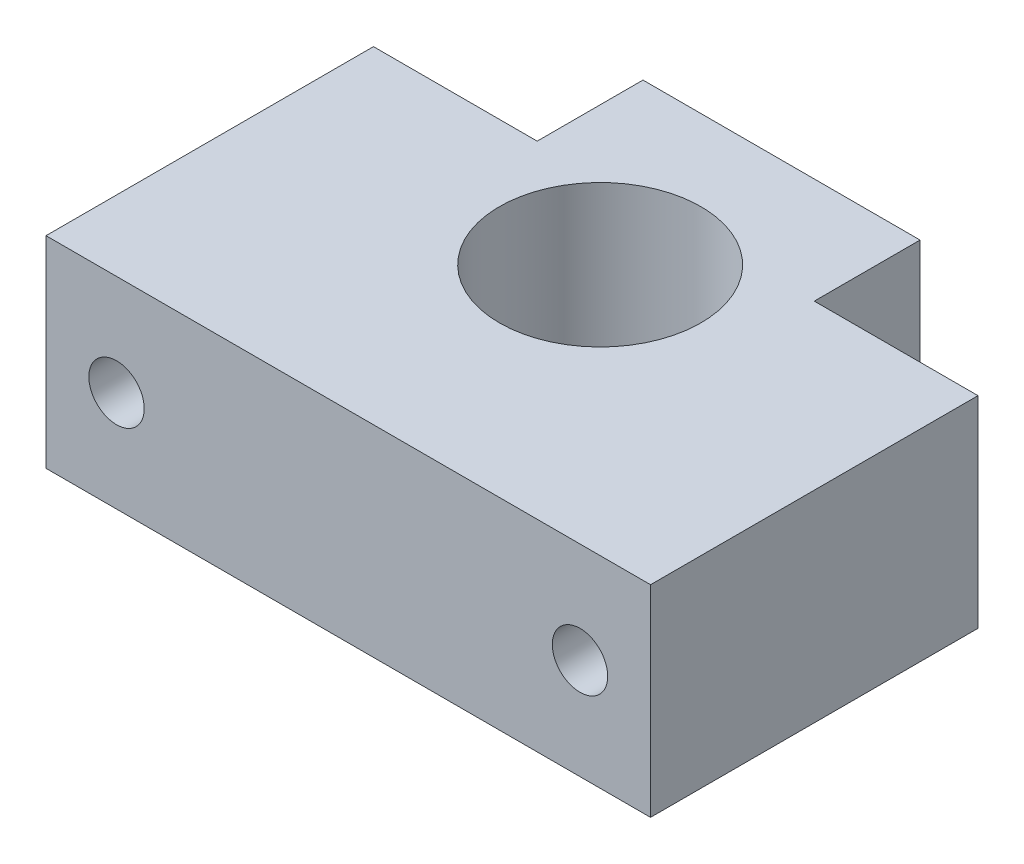
ISO-10303-21;
HEADER;
FILE_DESCRIPTION(('STEP AP214'),'2;1');
FILE_NAME('part.step','',(''),(''),'','','');
FILE_SCHEMA(('AUTOMOTIVE_DESIGN { 1 0 10303 214 1 1 1 1 }'));
ENDSEC;
DATA;
#1=APPLICATION_CONTEXT('core data for automotive mechanical design processes');
#2=APPLICATION_PROTOCOL_DEFINITION('international standard','automotive_design',2000,#1);
#3=PRODUCT_CONTEXT('',#1,'mechanical');
#4=PRODUCT('Part','Part','',(#3));
#5=PRODUCT_RELATED_PRODUCT_CATEGORY('part','',(#4));
#6=PRODUCT_DEFINITION_FORMATION('','',#4);
#7=PRODUCT_DEFINITION_CONTEXT('part definition',#1,'design');
#8=PRODUCT_DEFINITION('design','',#6,#7);
#9=PRODUCT_DEFINITION_SHAPE('','',#8);
#10=(LENGTH_UNIT() NAMED_UNIT(*) SI_UNIT(.MILLI.,.METRE.));
#11=(NAMED_UNIT(*) PLANE_ANGLE_UNIT() SI_UNIT($,.RADIAN.));
#12=(NAMED_UNIT(*) SI_UNIT($,.STERADIAN.) SOLID_ANGLE_UNIT());
#13=UNCERTAINTY_MEASURE_WITH_UNIT(LENGTH_MEASURE(1.E-05),#10,'distance_accuracy_value','');
#14=(GEOMETRIC_REPRESENTATION_CONTEXT(3) GLOBAL_UNCERTAINTY_ASSIGNED_CONTEXT((#13)) GLOBAL_UNIT_ASSIGNED_CONTEXT((#10,
#11,#12)) REPRESENTATION_CONTEXT('',''));
#15=CARTESIAN_POINT('',(0.,0.,0.));
#16=DIRECTION('',(0.,0.,1.));
#17=DIRECTION('',(1.,0.,0.));
#18=AXIS2_PLACEMENT_3D('',#15,#16,#17);
#19=CARTESIAN_POINT('',(60.,20.,0.));
#20=DIRECTION('',(0.,0.,-1.));
#21=DIRECTION('',(-1.,0.,0.));
#22=AXIS2_PLACEMENT_3D('',#19,#20,#21);
#23=PLANE('',#22);
#24=CARTESIAN_POINT('',(7.,10.,0.));
#25=DIRECTION('',(0.,0.,1.));
#26=DIRECTION('',(1.,0.,0.));
#27=AXIS2_PLACEMENT_3D('',#24,#25,#26);
#28=CIRCLE('',#27,2.75);
#29=CARTESIAN_POINT('',(9.75,10.,0.));
#30=VERTEX_POINT('',#29);
#31=EDGE_CURVE('E228',#30,#30,#28,.T.);
#32=ORIENTED_EDGE('',*,*,#31,.F.);
#33=EDGE_LOOP('',(#32));
#34=FACE_BOUND('',#33,.T.);
#35=CARTESIAN_POINT('',(53.,10.,0.));
#36=DIRECTION('',(0.,0.,1.));
#37=DIRECTION('',(1.,0.,0.));
#38=AXIS2_PLACEMENT_3D('',#35,#36,#37);
#39=CIRCLE('',#38,2.75);
#40=CARTESIAN_POINT('',(55.75,10.,0.));
#41=VERTEX_POINT('',#40);
#42=EDGE_CURVE('E224',#41,#41,#39,.T.);
#43=ORIENTED_EDGE('',*,*,#42,.F.);
#44=EDGE_LOOP('',(#43));
#45=FACE_BOUND('',#44,.T.);
#46=DIRECTION('',(1.,0.,0.));
#47=VECTOR('',#46,1.);
#48=CARTESIAN_POINT('',(60.,0.,0.));
#49=LINE('',#48,#47);
#50=CARTESIAN_POINT('',(0.,0.,0.));
#51=VERTEX_POINT('',#50);
#52=CARTESIAN_POINT('',(60.,0.,0.));
#53=VERTEX_POINT('',#52);
#54=EDGE_CURVE('E145',#51,#53,#49,.T.);
#55=ORIENTED_EDGE('',*,*,#54,.T.);
#56=DIRECTION('',(0.,-1.,0.));
#57=VECTOR('',#56,1.);
#58=CARTESIAN_POINT('',(60.,20.,0.));
#59=LINE('',#58,#57);
#60=CARTESIAN_POINT('',(60.,20.,0.));
#61=VERTEX_POINT('',#60);
#62=EDGE_CURVE('E11',#61,#53,#59,.T.);
#63=ORIENTED_EDGE('',*,*,#62,.F.);
#64=DIRECTION('',(1.,0.,0.));
#65=VECTOR('',#64,1.);
#66=CARTESIAN_POINT('',(60.,20.,0.));
#67=LINE('',#66,#65);
#68=CARTESIAN_POINT('',(0.,20.,0.));
#69=VERTEX_POINT('',#68);
#70=EDGE_CURVE('E168',#69,#61,#67,.T.);
#71=ORIENTED_EDGE('',*,*,#70,.F.);
#72=DIRECTION('',(0.,-1.,0.));
#73=VECTOR('',#72,1.);
#74=CARTESIAN_POINT('',(0.,20.,0.));
#75=LINE('',#74,#73);
#76=EDGE_CURVE('E141',#69,#51,#75,.T.);
#77=ORIENTED_EDGE('',*,*,#76,.T.);
#78=EDGE_LOOP('',(#55,#63,#71,#77));
#79=FACE_BOUND('',#78,.T.);
#80=ADVANCED_FACE('F44',(#34,#45,#79),#23,.F.);
#81=CARTESIAN_POINT('',(60.,20.,0.));
#82=DIRECTION('',(-1.,0.,0.));
#83=DIRECTION('',(0.,0.,1.));
#84=AXIS2_PLACEMENT_3D('',#81,#82,#83);
#85=PLANE('',#84);
#86=DIRECTION('',(0.,0.,-1.));
#87=VECTOR('',#86,1.);
#88=CARTESIAN_POINT('',(60.,0.,0.));
#89=LINE('',#88,#87);
#90=CARTESIAN_POINT('',(60.,0.,-32.5));
#91=VERTEX_POINT('',#90);
#92=EDGE_CURVE('E149',#53,#91,#89,.T.);
#93=ORIENTED_EDGE('',*,*,#92,.T.);
#94=DIRECTION('',(0.,-1.,0.));
#95=VECTOR('',#94,1.);
#96=CARTESIAN_POINT('',(60.,20.,-32.5));
#97=LINE('',#96,#95);
#98=CARTESIAN_POINT('',(60.,20.,-32.5));
#99=VERTEX_POINT('',#98);
#100=EDGE_CURVE('E53',#99,#91,#97,.T.);
#101=ORIENTED_EDGE('',*,*,#100,.F.);
#102=DIRECTION('',(0.,0.,-1.));
#103=VECTOR('',#102,1.);
#104=CARTESIAN_POINT('',(60.,20.,0.));
#105=LINE('',#104,#103);
#106=EDGE_CURVE('E104',#61,#99,#105,.T.);
#107=ORIENTED_EDGE('',*,*,#106,.F.);
#108=ORIENTED_EDGE('',*,*,#62,.T.);
#109=EDGE_LOOP('',(#93,#101,#107,#108));
#110=FACE_BOUND('',#109,.T.);
#111=ADVANCED_FACE('F247',(#110),#85,.F.);
#112=CARTESIAN_POINT('',(60.,20.,-32.5));
#113=DIRECTION('',(0.,0.,1.));
#114=DIRECTION('',(1.,0.,0.));
#115=AXIS2_PLACEMENT_3D('',#112,#113,#114);
#116=PLANE('',#115);
#117=DIRECTION('',(-1.,0.,0.));
#118=VECTOR('',#117,1.);
#119=CARTESIAN_POINT('',(60.,0.,-32.5));
#120=LINE('',#119,#118);
#121=CARTESIAN_POINT('',(43.75,0.,-32.5));
#122=VERTEX_POINT('',#121);
#123=EDGE_CURVE('E153',#91,#122,#120,.T.);
#124=ORIENTED_EDGE('',*,*,#123,.T.);
#125=DIRECTION('',(0.,-1.,0.));
#126=VECTOR('',#125,1.);
#127=CARTESIAN_POINT('',(43.75,20.,-32.5));
#128=LINE('',#127,#126);
#129=CARTESIAN_POINT('',(43.75,20.,-32.5));
#130=VERTEX_POINT('',#129);
#131=EDGE_CURVE('E179',#130,#122,#128,.T.);
#132=ORIENTED_EDGE('',*,*,#131,.F.);
#133=DIRECTION('',(-1.,0.,0.));
#134=VECTOR('',#133,1.);
#135=CARTESIAN_POINT('',(60.,20.,-32.5));
#136=LINE('',#135,#134);
#137=EDGE_CURVE('E189',#99,#130,#136,.T.);
#138=ORIENTED_EDGE('',*,*,#137,.F.);
#139=ORIENTED_EDGE('',*,*,#100,.T.);
#140=EDGE_LOOP('',(#124,#132,#138,#139));
#141=FACE_BOUND('',#140,.T.);
#142=ADVANCED_FACE('F187',(#141),#116,.F.);
#143=CARTESIAN_POINT('',(43.75,20.,-43.));
#144=DIRECTION('',(-1.,0.,0.));
#145=DIRECTION('',(0.,0.,1.));
#146=AXIS2_PLACEMENT_3D('',#143,#144,#145);
#147=PLANE('',#146);
#148=DIRECTION('',(0.,0.,-1.));
#149=VECTOR('',#148,1.);
#150=CARTESIAN_POINT('',(43.75,0.,-43.));
#151=LINE('',#150,#149);
#152=CARTESIAN_POINT('',(43.75,0.,-43.));
#153=VERTEX_POINT('',#152);
#154=EDGE_CURVE('E156',#122,#153,#151,.T.);
#155=ORIENTED_EDGE('',*,*,#154,.T.);
#156=DIRECTION('',(0.,-1.,0.));
#157=VECTOR('',#156,1.);
#158=CARTESIAN_POINT('',(43.75,20.,-43.));
#159=LINE('',#158,#157);
#160=CARTESIAN_POINT('',(43.75,20.,-43.));
#161=VERTEX_POINT('',#160);
#162=EDGE_CURVE('E175',#161,#153,#159,.T.);
#163=ORIENTED_EDGE('',*,*,#162,.F.);
#164=DIRECTION('',(0.,0.,-1.));
#165=VECTOR('',#164,1.);
#166=CARTESIAN_POINT('',(43.75,20.,-43.));
#167=LINE('',#166,#165);
#168=EDGE_CURVE('E202',#130,#161,#167,.T.);
#169=ORIENTED_EDGE('',*,*,#168,.F.);
#170=ORIENTED_EDGE('',*,*,#131,.T.);
#171=EDGE_LOOP('',(#155,#163,#169,#170));
#172=FACE_BOUND('',#171,.T.);
#173=ADVANCED_FACE('F197',(#172),#147,.F.);
#174=CARTESIAN_POINT('',(16.25,20.,-43.));
#175=DIRECTION('',(0.,0.,1.));
#176=DIRECTION('',(1.,0.,0.));
#177=AXIS2_PLACEMENT_3D('',#174,#175,#176);
#178=PLANE('',#177);
#179=DIRECTION('',(-1.,0.,0.));
#180=VECTOR('',#179,1.);
#181=CARTESIAN_POINT('',(16.25,0.,-43.));
#182=LINE('',#181,#180);
#183=CARTESIAN_POINT('',(16.25,0.,-43.));
#184=VERTEX_POINT('',#183);
#185=EDGE_CURVE('E159',#153,#184,#182,.T.);
#186=ORIENTED_EDGE('',*,*,#185,.T.);
#187=DIRECTION('',(0.,-1.,0.));
#188=VECTOR('',#187,1.);
#189=CARTESIAN_POINT('',(16.25,20.,-43.));
#190=LINE('',#189,#188);
#191=CARTESIAN_POINT('',(16.25,20.,-43.));
#192=VERTEX_POINT('',#191);
#193=EDGE_CURVE('E134',#192,#184,#190,.T.);
#194=ORIENTED_EDGE('',*,*,#193,.F.);
#195=DIRECTION('',(-1.,0.,0.));
#196=VECTOR('',#195,1.);
#197=CARTESIAN_POINT('',(16.25,20.,-43.));
#198=LINE('',#197,#196);
#199=EDGE_CURVE('E123',#161,#192,#198,.T.);
#200=ORIENTED_EDGE('',*,*,#199,.F.);
#201=ORIENTED_EDGE('',*,*,#162,.T.);
#202=EDGE_LOOP('',(#186,#194,#200,#201));
#203=FACE_BOUND('',#202,.T.);
#204=ADVANCED_FACE('F200',(#203),#178,.F.);
#205=CARTESIAN_POINT('',(16.25,20.,-43.));
#206=DIRECTION('',(1.,0.,0.));
#207=DIRECTION('',(0.,0.,-1.));
#208=AXIS2_PLACEMENT_3D('',#205,#206,#207);
#209=PLANE('',#208);
#210=DIRECTION('',(0.,0.,1.));
#211=VECTOR('',#210,1.);
#212=CARTESIAN_POINT('',(16.25,0.,-43.));
#213=LINE('',#212,#211);
#214=CARTESIAN_POINT('',(16.25,0.,-32.5));
#215=VERTEX_POINT('',#214);
#216=EDGE_CURVE('E132',#184,#215,#213,.T.);
#217=ORIENTED_EDGE('',*,*,#216,.T.);
#218=DIRECTION('',(0.,-1.,0.));
#219=VECTOR('',#218,1.);
#220=CARTESIAN_POINT('',(16.25,20.,-32.5));
#221=LINE('',#220,#219);
#222=CARTESIAN_POINT('',(16.25,20.,-32.5));
#223=VERTEX_POINT('',#222);
#224=EDGE_CURVE('E129',#223,#215,#221,.T.);
#225=ORIENTED_EDGE('',*,*,#224,.F.);
#226=DIRECTION('',(0.,0.,1.));
#227=VECTOR('',#226,1.);
#228=CARTESIAN_POINT('',(16.25,20.,-43.));
#229=LINE('',#228,#227);
#230=EDGE_CURVE('E117',#192,#223,#229,.T.);
#231=ORIENTED_EDGE('',*,*,#230,.F.);
#232=ORIENTED_EDGE('',*,*,#193,.T.);
#233=EDGE_LOOP('',(#217,#225,#231,#232));
#234=FACE_BOUND('',#233,.T.);
#235=ADVANCED_FACE('F130',(#234),#209,.F.);
#236=CARTESIAN_POINT('',(0.,20.,-32.5));
#237=DIRECTION('',(0.,0.,1.));
#238=DIRECTION('',(1.,0.,0.));
#239=AXIS2_PLACEMENT_3D('',#236,#237,#238);
#240=PLANE('',#239);
#241=DIRECTION('',(-1.,0.,0.));
#242=VECTOR('',#241,1.);
#243=CARTESIAN_POINT('',(0.,0.,-32.5));
#244=LINE('',#243,#242);
#245=CARTESIAN_POINT('',(0.,0.,-32.5));
#246=VERTEX_POINT('',#245);
#247=EDGE_CURVE('E90',#215,#246,#244,.T.);
#248=ORIENTED_EDGE('',*,*,#247,.T.);
#249=DIRECTION('',(0.,-1.,0.));
#250=VECTOR('',#249,1.);
#251=CARTESIAN_POINT('',(0.,20.,-32.5));
#252=LINE('',#251,#250);
#253=CARTESIAN_POINT('',(0.,20.,-32.5));
#254=VERTEX_POINT('',#253);
#255=EDGE_CURVE('E135',#254,#246,#252,.T.);
#256=ORIENTED_EDGE('',*,*,#255,.F.);
#257=DIRECTION('',(-1.,0.,0.));
#258=VECTOR('',#257,1.);
#259=CARTESIAN_POINT('',(0.,20.,-32.5));
#260=LINE('',#259,#258);
#261=EDGE_CURVE('E121',#223,#254,#260,.T.);
#262=ORIENTED_EDGE('',*,*,#261,.F.);
#263=ORIENTED_EDGE('',*,*,#224,.T.);
#264=EDGE_LOOP('',(#248,#256,#262,#263));
#265=FACE_BOUND('',#264,.T.);
#266=ADVANCED_FACE('F137',(#265),#240,.F.);
#267=CARTESIAN_POINT('',(0.,20.,-32.5));
#268=DIRECTION('',(1.,0.,0.));
#269=DIRECTION('',(0.,0.,-1.));
#270=AXIS2_PLACEMENT_3D('',#267,#268,#269);
#271=PLANE('',#270);
#272=DIRECTION('',(0.,0.,1.));
#273=VECTOR('',#272,1.);
#274=CARTESIAN_POINT('',(0.,0.,-32.5));
#275=LINE('',#274,#273);
#276=EDGE_CURVE('E96',#246,#51,#275,.T.);
#277=ORIENTED_EDGE('',*,*,#276,.T.);
#278=ORIENTED_EDGE('',*,*,#76,.F.);
#279=DIRECTION('',(0.,0.,1.));
#280=VECTOR('',#279,1.);
#281=CARTESIAN_POINT('',(0.,20.,-32.5));
#282=LINE('',#281,#280);
#283=EDGE_CURVE('E61',#254,#69,#282,.T.);
#284=ORIENTED_EDGE('',*,*,#283,.F.);
#285=ORIENTED_EDGE('',*,*,#255,.T.);
#286=EDGE_LOOP('',(#277,#278,#284,#285));
#287=FACE_BOUND('',#286,.T.);
#288=ADVANCED_FACE('F252',(#287),#271,.F.);
#289=CARTESIAN_POINT('',(0.,20.,0.));
#290=DIRECTION('',(0.,1.,0.));
#291=DIRECTION('',(0.,0.,1.));
#292=AXIS2_PLACEMENT_3D('',#289,#290,#291);
#293=PLANE('',#292);
#294=CARTESIAN_POINT('',(30.,20.,-25.));
#295=DIRECTION('',(0.,1.,0.));
#296=DIRECTION('',(0.,0.,1.));
#297=AXIS2_PLACEMENT_3D('',#294,#295,#296);
#298=CIRCLE('',#297,10.);
#299=CARTESIAN_POINT('',(30.,20.,-15.));
#300=VERTEX_POINT('',#299);
#301=EDGE_CURVE('E212',#300,#300,#298,.T.);
#302=ORIENTED_EDGE('',*,*,#301,.F.);
#303=EDGE_LOOP('',(#302));
#304=FACE_BOUND('',#303,.T.);
#305=ORIENTED_EDGE('',*,*,#70,.T.);
#306=ORIENTED_EDGE('',*,*,#106,.T.);
#307=ORIENTED_EDGE('',*,*,#137,.T.);
#308=ORIENTED_EDGE('',*,*,#168,.T.);
#309=ORIENTED_EDGE('',*,*,#199,.T.);
#310=ORIENTED_EDGE('',*,*,#230,.T.);
#311=ORIENTED_EDGE('',*,*,#261,.T.);
#312=ORIENTED_EDGE('',*,*,#283,.T.);
#313=EDGE_LOOP('',(#305,#306,#307,#308,#309,#310,#311,#312));
#314=FACE_BOUND('',#313,.T.);
#315=ADVANCED_FACE('F119',(#304,#314),#293,.T.);
#316=CARTESIAN_POINT('',(0.,0.,0.));
#317=DIRECTION('',(0.,1.,0.));
#318=DIRECTION('',(0.,0.,1.));
#319=AXIS2_PLACEMENT_3D('',#316,#317,#318);
#320=PLANE('',#319);
#321=CARTESIAN_POINT('',(30.,0.,-25.));
#322=DIRECTION('',(0.,1.,0.));
#323=DIRECTION('',(0.,0.,1.));
#324=AXIS2_PLACEMENT_3D('',#321,#322,#323);
#325=CIRCLE('',#324,10.);
#326=CARTESIAN_POINT('',(30.,0.,-15.));
#327=VERTEX_POINT('',#326);
#328=EDGE_CURVE('E150',#327,#327,#325,.T.);
#329=ORIENTED_EDGE('',*,*,#328,.T.);
#330=EDGE_LOOP('',(#329));
#331=FACE_BOUND('',#330,.T.);
#332=ORIENTED_EDGE('',*,*,#54,.F.);
#333=ORIENTED_EDGE('',*,*,#276,.F.);
#334=ORIENTED_EDGE('',*,*,#247,.F.);
#335=ORIENTED_EDGE('',*,*,#216,.F.);
#336=ORIENTED_EDGE('',*,*,#185,.F.);
#337=ORIENTED_EDGE('',*,*,#154,.F.);
#338=ORIENTED_EDGE('',*,*,#123,.F.);
#339=ORIENTED_EDGE('',*,*,#92,.F.);
#340=EDGE_LOOP('',(#332,#333,#334,#335,#336,#337,#338,#339));
#341=FACE_BOUND('',#340,.T.);
#342=ADVANCED_FACE('F193',(#331,#341),#320,.F.);
#343=CARTESIAN_POINT('',(30.,0.,-25.));
#344=DIRECTION('',(0.,1.,0.));
#345=DIRECTION('',(0.,0.,1.));
#346=AXIS2_PLACEMENT_3D('',#343,#344,#345);
#347=CYLINDRICAL_SURFACE('',#346,10.);
#348=ORIENTED_EDGE('',*,*,#328,.F.);
#349=EDGE_LOOP('',(#348));
#350=FACE_BOUND('',#349,.T.);
#351=ORIENTED_EDGE('',*,*,#301,.T.);
#352=EDGE_LOOP('',(#351));
#353=FACE_BOUND('',#352,.T.);
#354=ADVANCED_FACE('F320',(#350,#353),#347,.F.);
#355=CARTESIAN_POINT('',(53.,10.,-10.));
#356=DIRECTION('',(0.,0.,1.));
#357=DIRECTION('',(1.,0.,0.));
#358=AXIS2_PLACEMENT_3D('',#355,#356,#357);
#359=CYLINDRICAL_SURFACE('',#358,2.75);
#360=CARTESIAN_POINT('',(53.,10.,-10.));
#361=DIRECTION('',(0.,0.,1.));
#362=DIRECTION('',(1.,0.,0.));
#363=AXIS2_PLACEMENT_3D('',#360,#361,#362);
#364=CIRCLE('',#363,2.75);
#365=CARTESIAN_POINT('',(55.75,10.,-10.));
#366=VERTEX_POINT('',#365);
#367=EDGE_CURVE('E220',#366,#366,#364,.T.);
#368=ORIENTED_EDGE('',*,*,#367,.F.);
#369=EDGE_LOOP('',(#368));
#370=FACE_BOUND('',#369,.T.);
#371=ORIENTED_EDGE('',*,*,#42,.T.);
#372=EDGE_LOOP('',(#371));
#373=FACE_BOUND('',#372,.T.);
#374=ADVANCED_FACE('F329',(#370,#373),#359,.F.);
#375=CARTESIAN_POINT('',(53.,10.,-10.));
#376=DIRECTION('',(0.,0.,1.));
#377=DIRECTION('',(1.,0.,0.));
#378=AXIS2_PLACEMENT_3D('',#375,#376,#377);
#379=PLANE('',#378);
#380=ORIENTED_EDGE('',*,*,#367,.T.);
#381=EDGE_LOOP('',(#380));
#382=FACE_BOUND('',#381,.T.);
#383=ADVANCED_FACE('F241',(#382),#379,.T.);
#384=CARTESIAN_POINT('',(7.,10.,-10.));
#385=DIRECTION('',(0.,0.,1.));
#386=DIRECTION('',(1.,0.,0.));
#387=AXIS2_PLACEMENT_3D('',#384,#385,#386);
#388=CYLINDRICAL_SURFACE('',#387,2.75);
#389=CARTESIAN_POINT('',(7.,10.,-10.));
#390=DIRECTION('',(0.,0.,1.));
#391=DIRECTION('',(1.,0.,0.));
#392=AXIS2_PLACEMENT_3D('',#389,#390,#391);
#393=CIRCLE('',#392,2.75);
#394=CARTESIAN_POINT('',(9.75,10.,-10.));
#395=VERTEX_POINT('',#394);
#396=EDGE_CURVE('E216',#395,#395,#393,.T.);
#397=ORIENTED_EDGE('',*,*,#396,.F.);
#398=EDGE_LOOP('',(#397));
#399=FACE_BOUND('',#398,.T.);
#400=ORIENTED_EDGE('',*,*,#31,.T.);
#401=EDGE_LOOP('',(#400));
#402=FACE_BOUND('',#401,.T.);
#403=ADVANCED_FACE('F238',(#399,#402),#388,.F.);
#404=CARTESIAN_POINT('',(7.,10.,-10.));
#405=DIRECTION('',(0.,0.,1.));
#406=DIRECTION('',(1.,0.,0.));
#407=AXIS2_PLACEMENT_3D('',#404,#405,#406);
#408=PLANE('',#407);
#409=ORIENTED_EDGE('',*,*,#396,.T.);
#410=EDGE_LOOP('',(#409));
#411=FACE_BOUND('',#410,.T.);
#412=ADVANCED_FACE('F236',(#411),#408,.T.);
#413=CLOSED_SHELL('',(#80,#111,#142,#173,#204,#235,#266,#288,#315,#342,#354,#374,#383,#403,#412));
#414=MANIFOLD_SOLID_BREP('B2',#413);
#415=ADVANCED_BREP_SHAPE_REPRESENTATION('',(#18,#414),#14);
#416=SHAPE_DEFINITION_REPRESENTATION(#9,#415);
ENDSEC;
END-ISO-10303-21;
